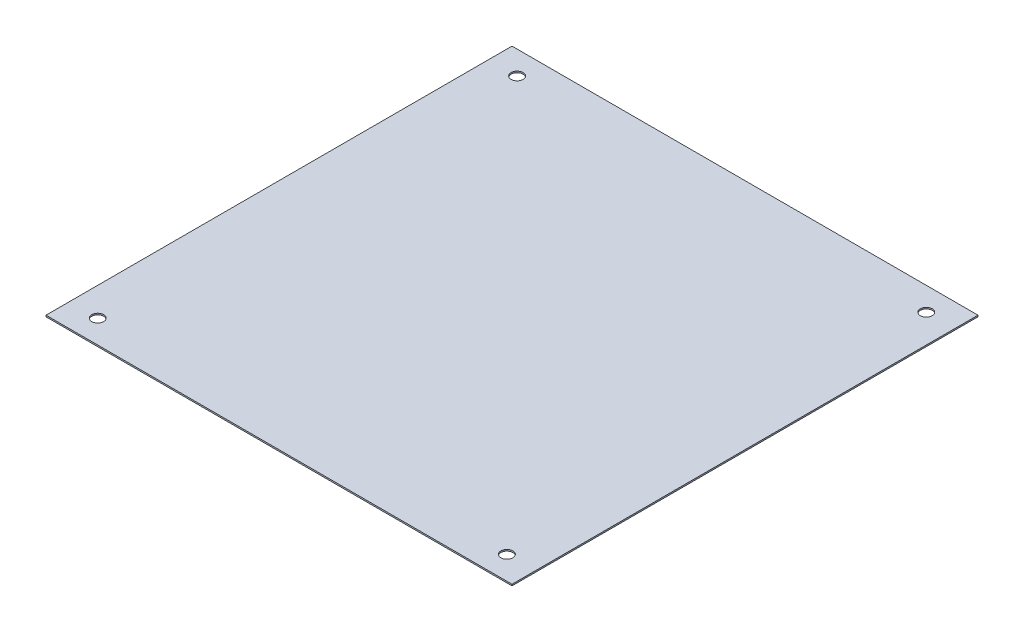
ISO-10303-21;
HEADER;
FILE_DESCRIPTION(('STEP AP214'),'2;1');
FILE_NAME('part.step','',(''),(''),'','','');
FILE_SCHEMA(('AUTOMOTIVE_DESIGN { 1 0 10303 214 1 1 1 1 }'));
ENDSEC;
DATA;
#1=APPLICATION_CONTEXT('core data for automotive mechanical design processes');
#2=APPLICATION_PROTOCOL_DEFINITION('international standard','automotive_design',2000,#1);
#3=PRODUCT_CONTEXT('',#1,'mechanical');
#4=PRODUCT('Part','Part','',(#3));
#5=PRODUCT_RELATED_PRODUCT_CATEGORY('part','',(#4));
#6=PRODUCT_DEFINITION_FORMATION('','',#4);
#7=PRODUCT_DEFINITION_CONTEXT('part definition',#1,'design');
#8=PRODUCT_DEFINITION('design','',#6,#7);
#9=PRODUCT_DEFINITION_SHAPE('','',#8);
#10=(LENGTH_UNIT() NAMED_UNIT(*) SI_UNIT(.MILLI.,.METRE.));
#11=(NAMED_UNIT(*) PLANE_ANGLE_UNIT() SI_UNIT($,.RADIAN.));
#12=(NAMED_UNIT(*) SI_UNIT($,.STERADIAN.) SOLID_ANGLE_UNIT());
#13=UNCERTAINTY_MEASURE_WITH_UNIT(LENGTH_MEASURE(1.E-05),#10,'distance_accuracy_value','');
#14=(GEOMETRIC_REPRESENTATION_CONTEXT(3) GLOBAL_UNCERTAINTY_ASSIGNED_CONTEXT((#13)) GLOBAL_UNIT_ASSIGNED_CONTEXT((#10,
#11,#12)) REPRESENTATION_CONTEXT('',''));
#15=CARTESIAN_POINT('',(0.,0.,0.));
#16=DIRECTION('',(0.,0.,1.));
#17=DIRECTION('',(1.,0.,0.));
#18=AXIS2_PLACEMENT_3D('',#15,#16,#17);
#19=CARTESIAN_POINT('',(0.,0.79375,0.));
#20=DIRECTION('',(0.,-1.,0.));
#21=DIRECTION('',(0.,0.,-1.));
#22=AXIS2_PLACEMENT_3D('',#19,#20,#21);
#23=PLANE('',#22);
#24=CARTESIAN_POINT('',(238.506,0.79375,-12.7));
#25=DIRECTION('',(0.,1.,0.));
#26=DIRECTION('',(0.,0.,1.));
#27=AXIS2_PLACEMENT_3D('',#24,#25,#26);
#28=CIRCLE('',#27,3.26389999999998);
#29=CARTESIAN_POINT('',(238.506,0.79375,-9.43610000000001));
#30=VERTEX_POINT('',#29);
#31=EDGE_CURVE('E121',#30,#30,#28,.T.);
#32=ORIENTED_EDGE('',*,*,#31,.F.);
#33=EDGE_LOOP('',(#32));
#34=FACE_BOUND('',#33,.T.);
#35=CARTESIAN_POINT('',(15.494,0.79375,-241.3));
#36=DIRECTION('',(0.,1.,0.));
#37=DIRECTION('',(0.,0.,1.));
#38=AXIS2_PLACEMENT_3D('',#35,#36,#37);
#39=CIRCLE('',#38,3.2639);
#40=CARTESIAN_POINT('',(15.494,0.79375,-238.0361));
#41=VERTEX_POINT('',#40);
#42=EDGE_CURVE('E100',#41,#41,#39,.T.);
#43=ORIENTED_EDGE('',*,*,#42,.F.);
#44=EDGE_LOOP('',(#43));
#45=FACE_BOUND('',#44,.T.);
#46=DIRECTION('',(0.,0.,1.));
#47=VECTOR('',#46,1.);
#48=CARTESIAN_POINT('',(0.,0.79375,0.));
#49=LINE('',#48,#47);
#50=CARTESIAN_POINT('',(0.,0.79375,-254.));
#51=VERTEX_POINT('',#50);
#52=CARTESIAN_POINT('',(0.,0.79375,0.));
#53=VERTEX_POINT('',#52);
#54=EDGE_CURVE('E85',#51,#53,#49,.T.);
#55=ORIENTED_EDGE('',*,*,#54,.T.);
#56=DIRECTION('',(1.,0.,0.));
#57=VECTOR('',#56,1.);
#58=CARTESIAN_POINT('',(0.,0.79375,0.));
#59=LINE('',#58,#57);
#60=CARTESIAN_POINT('',(254.,0.79375,0.));
#61=VERTEX_POINT('',#60);
#62=EDGE_CURVE('E80',#53,#61,#59,.T.);
#63=ORIENTED_EDGE('',*,*,#62,.T.);
#64=DIRECTION('',(0.,0.,-1.));
#65=VECTOR('',#64,1.);
#66=CARTESIAN_POINT('',(254.,0.79375,0.));
#67=LINE('',#66,#65);
#68=CARTESIAN_POINT('',(254.,0.79375,-254.));
#69=VERTEX_POINT('',#68);
#70=EDGE_CURVE('E83',#61,#69,#67,.T.);
#71=ORIENTED_EDGE('',*,*,#70,.T.);
#72=DIRECTION('',(-1.,0.,0.));
#73=VECTOR('',#72,1.);
#74=CARTESIAN_POINT('',(0.,0.79375,-254.));
#75=LINE('',#74,#73);
#76=EDGE_CURVE('E50',#69,#51,#75,.T.);
#77=ORIENTED_EDGE('',*,*,#76,.T.);
#78=EDGE_LOOP('',(#55,#63,#71,#77));
#79=FACE_BOUND('',#78,.T.);
#80=CARTESIAN_POINT('',(238.506,0.79375,-241.3));
#81=DIRECTION('',(0.,1.,0.));
#82=DIRECTION('',(0.,0.,1.));
#83=AXIS2_PLACEMENT_3D('',#80,#81,#82);
#84=CIRCLE('',#83,3.26389999999998);
#85=CARTESIAN_POINT('',(238.506,0.79375,-238.0361));
#86=VERTEX_POINT('',#85);
#87=EDGE_CURVE('E115',#86,#86,#84,.T.);
#88=ORIENTED_EDGE('',*,*,#87,.F.);
#89=EDGE_LOOP('',(#88));
#90=FACE_BOUND('',#89,.T.);
#91=CARTESIAN_POINT('',(15.494,0.79375,-12.7));
#92=DIRECTION('',(0.,1.,0.));
#93=DIRECTION('',(0.,0.,1.));
#94=AXIS2_PLACEMENT_3D('',#91,#92,#93);
#95=CIRCLE('',#94,3.2639);
#96=CARTESIAN_POINT('',(15.494,0.79375,-9.43609999999999));
#97=VERTEX_POINT('',#96);
#98=EDGE_CURVE('E127',#97,#97,#95,.T.);
#99=ORIENTED_EDGE('',*,*,#98,.F.);
#100=EDGE_LOOP('',(#99));
#101=FACE_BOUND('',#100,.T.);
#102=ADVANCED_FACE('F33',(#34,#45,#79,#90,#101),#23,.F.);
#103=CARTESIAN_POINT('',(0.,0.,0.));
#104=DIRECTION('',(0.,-1.,0.));
#105=DIRECTION('',(0.,0.,-1.));
#106=AXIS2_PLACEMENT_3D('',#103,#104,#105);
#107=PLANE('',#106);
#108=CARTESIAN_POINT('',(238.506,0.,-12.7));
#109=DIRECTION('',(0.,1.,0.));
#110=DIRECTION('',(0.,0.,1.));
#111=AXIS2_PLACEMENT_3D('',#108,#109,#110);
#112=CIRCLE('',#111,3.26389999999998);
#113=CARTESIAN_POINT('',(238.506,0.,-9.43610000000001));
#114=VERTEX_POINT('',#113);
#115=EDGE_CURVE('E124',#114,#114,#112,.T.);
#116=ORIENTED_EDGE('',*,*,#115,.T.);
#117=EDGE_LOOP('',(#116));
#118=FACE_BOUND('',#117,.T.);
#119=CARTESIAN_POINT('',(15.494,0.,-241.3));
#120=DIRECTION('',(0.,1.,0.));
#121=DIRECTION('',(0.,0.,1.));
#122=AXIS2_PLACEMENT_3D('',#119,#120,#121);
#123=CIRCLE('',#122,3.2639);
#124=CARTESIAN_POINT('',(15.494,0.,-238.0361));
#125=VERTEX_POINT('',#124);
#126=EDGE_CURVE('E112',#125,#125,#123,.T.);
#127=ORIENTED_EDGE('',*,*,#126,.T.);
#128=EDGE_LOOP('',(#127));
#129=FACE_BOUND('',#128,.T.);
#130=DIRECTION('',(0.,0.,1.));
#131=VECTOR('',#130,1.);
#132=CARTESIAN_POINT('',(0.,0.,0.));
#133=LINE('',#132,#131);
#134=CARTESIAN_POINT('',(0.,0.,-254.));
#135=VERTEX_POINT('',#134);
#136=CARTESIAN_POINT('',(0.,0.,0.));
#137=VERTEX_POINT('',#136);
#138=EDGE_CURVE('E97',#135,#137,#133,.T.);
#139=ORIENTED_EDGE('',*,*,#138,.F.);
#140=DIRECTION('',(-1.,0.,0.));
#141=VECTOR('',#140,1.);
#142=CARTESIAN_POINT('',(0.,0.,-254.));
#143=LINE('',#142,#141);
#144=CARTESIAN_POINT('',(254.,0.,-254.));
#145=VERTEX_POINT('',#144);
#146=EDGE_CURVE('E73',#145,#135,#143,.T.);
#147=ORIENTED_EDGE('',*,*,#146,.F.);
#148=DIRECTION('',(0.,0.,-1.));
#149=VECTOR('',#148,1.);
#150=CARTESIAN_POINT('',(254.,0.,0.));
#151=LINE('',#150,#149);
#152=CARTESIAN_POINT('',(254.,0.,0.));
#153=VERTEX_POINT('',#152);
#154=EDGE_CURVE('E67',#153,#145,#151,.T.);
#155=ORIENTED_EDGE('',*,*,#154,.F.);
#156=DIRECTION('',(1.,0.,0.));
#157=VECTOR('',#156,1.);
#158=CARTESIAN_POINT('',(0.,0.,0.));
#159=LINE('',#158,#157);
#160=EDGE_CURVE('E89',#137,#153,#159,.T.);
#161=ORIENTED_EDGE('',*,*,#160,.F.);
#162=EDGE_LOOP('',(#139,#147,#155,#161));
#163=FACE_BOUND('',#162,.T.);
#164=CARTESIAN_POINT('',(238.506,0.,-241.3));
#165=DIRECTION('',(0.,1.,0.));
#166=DIRECTION('',(0.,0.,1.));
#167=AXIS2_PLACEMENT_3D('',#164,#165,#166);
#168=CIRCLE('',#167,3.26389999999998);
#169=CARTESIAN_POINT('',(238.506,0.,-238.0361));
#170=VERTEX_POINT('',#169);
#171=EDGE_CURVE('E118',#170,#170,#168,.T.);
#172=ORIENTED_EDGE('',*,*,#171,.T.);
#173=EDGE_LOOP('',(#172));
#174=FACE_BOUND('',#173,.T.);
#175=CARTESIAN_POINT('',(15.494,0.,-12.7));
#176=DIRECTION('',(0.,1.,0.));
#177=DIRECTION('',(0.,0.,1.));
#178=AXIS2_PLACEMENT_3D('',#175,#176,#177);
#179=CIRCLE('',#178,3.2639);
#180=CARTESIAN_POINT('',(15.494,0.,-9.43609999999999));
#181=VERTEX_POINT('',#180);
#182=EDGE_CURVE('E130',#181,#181,#179,.T.);
#183=ORIENTED_EDGE('',*,*,#182,.T.);
#184=EDGE_LOOP('',(#183));
#185=FACE_BOUND('',#184,.T.);
#186=ADVANCED_FACE('F108',(#118,#129,#163,#174,#185),#107,.T.);
#187=CARTESIAN_POINT('',(0.,0.79375,0.));
#188=DIRECTION('',(1.,0.,0.));
#189=DIRECTION('',(0.,0.,-1.));
#190=AXIS2_PLACEMENT_3D('',#187,#188,#189);
#191=PLANE('',#190);
#192=ORIENTED_EDGE('',*,*,#138,.T.);
#193=DIRECTION('',(0.,-1.,0.));
#194=VECTOR('',#193,1.);
#195=CARTESIAN_POINT('',(0.,0.79375,0.));
#196=LINE('',#195,#194);
#197=EDGE_CURVE('E11',#53,#137,#196,.T.);
#198=ORIENTED_EDGE('',*,*,#197,.F.);
#199=ORIENTED_EDGE('',*,*,#54,.F.);
#200=DIRECTION('',(0.,-1.,0.));
#201=VECTOR('',#200,1.);
#202=CARTESIAN_POINT('',(0.,0.79375,-254.));
#203=LINE('',#202,#201);
#204=EDGE_CURVE('E93',#51,#135,#203,.T.);
#205=ORIENTED_EDGE('',*,*,#204,.T.);
#206=EDGE_LOOP('',(#192,#198,#199,#205));
#207=FACE_BOUND('',#206,.T.);
#208=ADVANCED_FACE('F35',(#207),#191,.F.);
#209=CARTESIAN_POINT('',(0.,0.79375,0.));
#210=DIRECTION('',(0.,0.,-1.));
#211=DIRECTION('',(-1.,0.,0.));
#212=AXIS2_PLACEMENT_3D('',#209,#210,#211);
#213=PLANE('',#212);
#214=ORIENTED_EDGE('',*,*,#160,.T.);
#215=DIRECTION('',(0.,-1.,0.));
#216=VECTOR('',#215,1.);
#217=CARTESIAN_POINT('',(254.,0.79375,0.));
#218=LINE('',#217,#216);
#219=EDGE_CURVE('E42',#61,#153,#218,.T.);
#220=ORIENTED_EDGE('',*,*,#219,.F.);
#221=ORIENTED_EDGE('',*,*,#62,.F.);
#222=ORIENTED_EDGE('',*,*,#197,.T.);
#223=EDGE_LOOP('',(#214,#220,#221,#222));
#224=FACE_BOUND('',#223,.T.);
#225=ADVANCED_FACE('F88',(#224),#213,.F.);
#226=CARTESIAN_POINT('',(254.,0.79375,0.));
#227=DIRECTION('',(-1.,0.,0.));
#228=DIRECTION('',(0.,0.,1.));
#229=AXIS2_PLACEMENT_3D('',#226,#227,#228);
#230=PLANE('',#229);
#231=ORIENTED_EDGE('',*,*,#154,.T.);
#232=DIRECTION('',(0.,-1.,0.));
#233=VECTOR('',#232,1.);
#234=CARTESIAN_POINT('',(254.,0.79375,-254.));
#235=LINE('',#234,#233);
#236=EDGE_CURVE('E90',#69,#145,#235,.T.);
#237=ORIENTED_EDGE('',*,*,#236,.F.);
#238=ORIENTED_EDGE('',*,*,#70,.F.);
#239=ORIENTED_EDGE('',*,*,#219,.T.);
#240=EDGE_LOOP('',(#231,#237,#238,#239));
#241=FACE_BOUND('',#240,.T.);
#242=ADVANCED_FACE('F91',(#241),#230,.F.);
#243=CARTESIAN_POINT('',(0.,0.79375,-254.));
#244=DIRECTION('',(0.,0.,1.));
#245=DIRECTION('',(1.,0.,0.));
#246=AXIS2_PLACEMENT_3D('',#243,#244,#245);
#247=PLANE('',#246);
#248=ORIENTED_EDGE('',*,*,#146,.T.);
#249=ORIENTED_EDGE('',*,*,#204,.F.);
#250=ORIENTED_EDGE('',*,*,#76,.F.);
#251=ORIENTED_EDGE('',*,*,#236,.T.);
#252=EDGE_LOOP('',(#248,#249,#250,#251));
#253=FACE_BOUND('',#252,.T.);
#254=ADVANCED_FACE('F105',(#253),#247,.F.);
#255=CARTESIAN_POINT('',(15.494,0.79375,-241.3));
#256=DIRECTION('',(0.,-1.,0.));
#257=DIRECTION('',(0.,0.,-1.));
#258=AXIS2_PLACEMENT_3D('',#255,#256,#257);
#259=CYLINDRICAL_SURFACE('',#258,3.2639);
#260=ORIENTED_EDGE('',*,*,#42,.T.);
#261=EDGE_LOOP('',(#260));
#262=FACE_BOUND('',#261,.T.);
#263=ORIENTED_EDGE('',*,*,#126,.F.);
#264=EDGE_LOOP('',(#263));
#265=FACE_BOUND('',#264,.T.);
#266=ADVANCED_FACE('F150',(#262,#265),#259,.F.);
#267=CARTESIAN_POINT('',(238.506,0.79375,-241.3));
#268=DIRECTION('',(0.,-1.,0.));
#269=DIRECTION('',(0.,0.,-1.));
#270=AXIS2_PLACEMENT_3D('',#267,#268,#269);
#271=CYLINDRICAL_SURFACE('',#270,3.26389999999998);
#272=ORIENTED_EDGE('',*,*,#87,.T.);
#273=EDGE_LOOP('',(#272));
#274=FACE_BOUND('',#273,.T.);
#275=ORIENTED_EDGE('',*,*,#171,.F.);
#276=EDGE_LOOP('',(#275));
#277=FACE_BOUND('',#276,.T.);
#278=ADVANCED_FACE('F196',(#274,#277),#271,.F.);
#279=CARTESIAN_POINT('',(238.506,0.79375,-12.7));
#280=DIRECTION('',(0.,-1.,0.));
#281=DIRECTION('',(0.,0.,-1.));
#282=AXIS2_PLACEMENT_3D('',#279,#280,#281);
#283=CYLINDRICAL_SURFACE('',#282,3.26389999999998);
#284=ORIENTED_EDGE('',*,*,#31,.T.);
#285=EDGE_LOOP('',(#284));
#286=FACE_BOUND('',#285,.T.);
#287=ORIENTED_EDGE('',*,*,#115,.F.);
#288=EDGE_LOOP('',(#287));
#289=FACE_BOUND('',#288,.T.);
#290=ADVANCED_FACE('F204',(#286,#289),#283,.F.);
#291=CARTESIAN_POINT('',(15.494,0.79375,-12.7));
#292=DIRECTION('',(0.,-1.,0.));
#293=DIRECTION('',(0.,0.,-1.));
#294=AXIS2_PLACEMENT_3D('',#291,#292,#293);
#295=CYLINDRICAL_SURFACE('',#294,3.2639);
#296=ORIENTED_EDGE('',*,*,#98,.T.);
#297=EDGE_LOOP('',(#296));
#298=FACE_BOUND('',#297,.T.);
#299=ORIENTED_EDGE('',*,*,#182,.F.);
#300=EDGE_LOOP('',(#299));
#301=FACE_BOUND('',#300,.T.);
#302=ADVANCED_FACE('F136',(#298,#301),#295,.F.);
#303=CLOSED_SHELL('',(#102,#186,#208,#225,#242,#254,#266,#278,#290,#302));
#304=MANIFOLD_SOLID_BREP('B2',#303);
#305=ADVANCED_BREP_SHAPE_REPRESENTATION('',(#18,#304),#14);
#306=SHAPE_DEFINITION_REPRESENTATION(#9,#305);
ENDSEC;
END-ISO-10303-21;
